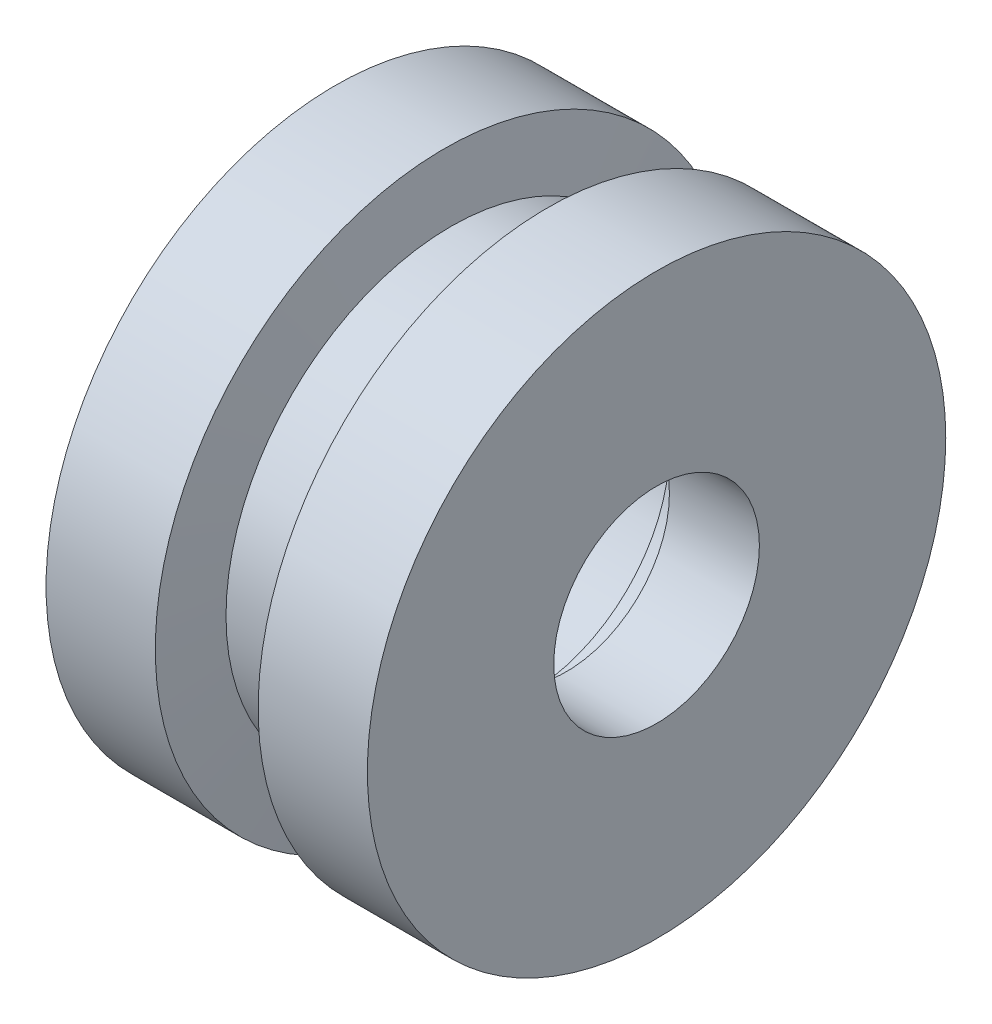
ISO-10303-21;
HEADER;
FILE_DESCRIPTION(('STEP AP214'),'2;1');
FILE_NAME('part.step','',(''),(''),'','','');
FILE_SCHEMA(('AUTOMOTIVE_DESIGN { 1 0 10303 214 1 1 1 1 }'));
ENDSEC;
DATA;
#1=APPLICATION_CONTEXT('core data for automotive mechanical design processes');
#2=APPLICATION_PROTOCOL_DEFINITION('international standard','automotive_design',2000,#1);
#3=PRODUCT_CONTEXT('',#1,'mechanical');
#4=PRODUCT('Part','Part','',(#3));
#5=PRODUCT_RELATED_PRODUCT_CATEGORY('part','',(#4));
#6=PRODUCT_DEFINITION_FORMATION('','',#4);
#7=PRODUCT_DEFINITION_CONTEXT('part definition',#1,'design');
#8=PRODUCT_DEFINITION('design','',#6,#7);
#9=PRODUCT_DEFINITION_SHAPE('','',#8);
#10=(LENGTH_UNIT() NAMED_UNIT(*) SI_UNIT(.MILLI.,.METRE.));
#11=(NAMED_UNIT(*) PLANE_ANGLE_UNIT() SI_UNIT($,.RADIAN.));
#12=(NAMED_UNIT(*) SI_UNIT($,.STERADIAN.) SOLID_ANGLE_UNIT());
#13=UNCERTAINTY_MEASURE_WITH_UNIT(LENGTH_MEASURE(1.E-05),#10,'distance_accuracy_value','');
#14=(GEOMETRIC_REPRESENTATION_CONTEXT(3) GLOBAL_UNCERTAINTY_ASSIGNED_CONTEXT((#13)) GLOBAL_UNIT_ASSIGNED_CONTEXT((#10,
#11,#12)) REPRESENTATION_CONTEXT('',''));
#15=CARTESIAN_POINT('',(0.,0.,0.));
#16=DIRECTION('',(0.,0.,1.));
#17=DIRECTION('',(1.,0.,0.));
#18=AXIS2_PLACEMENT_3D('',#15,#16,#17);
#19=CARTESIAN_POINT('',(0.,0.,0.));
#20=DIRECTION('',(-1.,0.,0.));
#21=DIRECTION('',(0.,0.,-1.));
#22=AXIS2_PLACEMENT_3D('',#19,#20,#21);
#23=CYLINDRICAL_SURFACE('',#22,22.5);
#24=CARTESIAN_POINT('',(0.,0.,0.));
#25=DIRECTION('',(1.,0.,0.));
#26=DIRECTION('',(0.,0.,-1.));
#27=AXIS2_PLACEMENT_3D('',#24,#25,#26);
#28=CIRCLE('',#27,22.5);
#29=CARTESIAN_POINT('',(0.,0.,-22.5));
#30=VERTEX_POINT('',#29);
#31=EDGE_CURVE('E62',#30,#30,#28,.T.);
#32=ORIENTED_EDGE('',*,*,#31,.T.);
#33=EDGE_LOOP('',(#32));
#34=FACE_BOUND('',#33,.T.);
#35=CARTESIAN_POINT('',(8.49999999999999,0.,0.));
#36=DIRECTION('',(1.,0.,0.));
#37=DIRECTION('',(0.,0.,-1.));
#38=AXIS2_PLACEMENT_3D('',#35,#36,#37);
#39=CIRCLE('',#38,22.5);
#40=CARTESIAN_POINT('',(8.49999999999998,0.,-22.5));
#41=VERTEX_POINT('',#40);
#42=EDGE_CURVE('E65',#41,#41,#39,.T.);
#43=ORIENTED_EDGE('',*,*,#42,.F.);
#44=EDGE_LOOP('',(#43));
#45=FACE_BOUND('',#44,.T.);
#46=ADVANCED_FACE('F33',(#34,#45),#23,.T.);
#47=CARTESIAN_POINT('',(25.,0.,0.));
#48=DIRECTION('',(1.,0.,0.));
#49=DIRECTION('',(0.,0.,-1.));
#50=AXIS2_PLACEMENT_3D('',#47,#48,#49);
#51=CIRCLE('',#50,22.5);
#52=CARTESIAN_POINT('',(25.,0.,-22.5));
#53=VERTEX_POINT('',#52);
#54=EDGE_CURVE('E59',#53,#53,#51,.T.);
#55=ORIENTED_EDGE('',*,*,#54,.F.);
#56=EDGE_LOOP('',(#55));
#57=FACE_BOUND('',#56,.T.);
#58=CARTESIAN_POINT('',(16.5,0.,0.));
#59=DIRECTION('',(1.,0.,0.));
#60=DIRECTION('',(0.,0.,-1.));
#61=AXIS2_PLACEMENT_3D('',#58,#59,#60);
#62=CIRCLE('',#61,22.5);
#63=CARTESIAN_POINT('',(16.5,0.,-22.5));
#64=VERTEX_POINT('',#63);
#65=EDGE_CURVE('E74',#64,#64,#62,.T.);
#66=ORIENTED_EDGE('',*,*,#65,.T.);
#67=EDGE_LOOP('',(#66));
#68=FACE_BOUND('',#67,.T.);
#69=ADVANCED_FACE('F78',(#57,#68),#23,.T.);
#70=CARTESIAN_POINT('',(0.,0.,22.5));
#71=DIRECTION('',(1.,0.,0.));
#72=DIRECTION('',(0.,0.,1.));
#73=AXIS2_PLACEMENT_3D('',#70,#71,#72);
#74=PLANE('',#73);
#75=CARTESIAN_POINT('',(0.,0.,0.));
#76=DIRECTION('',(1.,0.,0.));
#77=DIRECTION('',(0.,0.,-1.));
#78=AXIS2_PLACEMENT_3D('',#75,#76,#77);
#79=CIRCLE('',#78,12.);
#80=CARTESIAN_POINT('',(0.,0.,-12.));
#81=VERTEX_POINT('',#80);
#82=EDGE_CURVE('E10',#81,#81,#79,.T.);
#83=ORIENTED_EDGE('',*,*,#82,.T.);
#84=EDGE_LOOP('',(#83));
#85=FACE_BOUND('',#84,.T.);
#86=ORIENTED_EDGE('',*,*,#31,.F.);
#87=EDGE_LOOP('',(#86));
#88=FACE_BOUND('',#87,.T.);
#89=ADVANCED_FACE('F35',(#85,#88),#74,.F.);
#90=CARTESIAN_POINT('',(0.,0.,0.));
#91=DIRECTION('',(-1.,0.,0.));
#92=DIRECTION('',(0.,0.,-1.));
#93=AXIS2_PLACEMENT_3D('',#90,#91,#92);
#94=CYLINDRICAL_SURFACE('',#93,12.);
#95=CARTESIAN_POINT('',(15.,0.,0.));
#96=DIRECTION('',(1.,0.,0.));
#97=DIRECTION('',(0.,0.,-1.));
#98=AXIS2_PLACEMENT_3D('',#95,#96,#97);
#99=CIRCLE('',#98,12.);
#100=CARTESIAN_POINT('',(15.,0.,-12.));
#101=VERTEX_POINT('',#100);
#102=EDGE_CURVE('E40',#101,#101,#99,.T.);
#103=ORIENTED_EDGE('',*,*,#102,.T.);
#104=EDGE_LOOP('',(#103));
#105=FACE_BOUND('',#104,.T.);
#106=ORIENTED_EDGE('',*,*,#82,.F.);
#107=EDGE_LOOP('',(#106));
#108=FACE_BOUND('',#107,.T.);
#109=ADVANCED_FACE('F124',(#105,#108),#94,.F.);
#110=CARTESIAN_POINT('',(15.,0.,12.));
#111=DIRECTION('',(1.,0.,0.));
#112=DIRECTION('',(0.,0.,1.));
#113=AXIS2_PLACEMENT_3D('',#110,#111,#112);
#114=PLANE('',#113);
#115=CARTESIAN_POINT('',(15.,0.,0.));
#116=DIRECTION('',(1.,0.,0.));
#117=DIRECTION('',(0.,0.,-1.));
#118=AXIS2_PLACEMENT_3D('',#115,#116,#117);
#119=CIRCLE('',#118,11.);
#120=CARTESIAN_POINT('',(15.,0.,-11.));
#121=VERTEX_POINT('',#120);
#122=EDGE_CURVE('E44',#121,#121,#119,.T.);
#123=ORIENTED_EDGE('',*,*,#122,.T.);
#124=EDGE_LOOP('',(#123));
#125=FACE_BOUND('',#124,.T.);
#126=ORIENTED_EDGE('',*,*,#102,.F.);
#127=EDGE_LOOP('',(#126));
#128=FACE_BOUND('',#127,.T.);
#129=ADVANCED_FACE('F121',(#125,#128),#114,.F.);
#130=CARTESIAN_POINT('',(0.,0.,0.));
#131=DIRECTION('',(-1.,0.,0.));
#132=DIRECTION('',(0.,0.,-1.));
#133=AXIS2_PLACEMENT_3D('',#130,#131,#132);
#134=CYLINDRICAL_SURFACE('',#133,11.);
#135=CARTESIAN_POINT('',(18.,0.,0.));
#136=DIRECTION('',(1.,0.,0.));
#137=DIRECTION('',(0.,0.,-1.));
#138=AXIS2_PLACEMENT_3D('',#135,#136,#137);
#139=CIRCLE('',#138,11.);
#140=CARTESIAN_POINT('',(18.,0.,-11.));
#141=VERTEX_POINT('',#140);
#142=EDGE_CURVE('E48',#141,#141,#139,.T.);
#143=ORIENTED_EDGE('',*,*,#142,.T.);
#144=EDGE_LOOP('',(#143));
#145=FACE_BOUND('',#144,.T.);
#146=ORIENTED_EDGE('',*,*,#122,.F.);
#147=EDGE_LOOP('',(#146));
#148=FACE_BOUND('',#147,.T.);
#149=ADVANCED_FACE('F117',(#145,#148),#134,.F.);
#150=CARTESIAN_POINT('',(18.,0.,11.));
#151=DIRECTION('',(1.,0.,0.));
#152=DIRECTION('',(0.,0.,1.));
#153=AXIS2_PLACEMENT_3D('',#150,#151,#152);
#154=PLANE('',#153);
#155=CARTESIAN_POINT('',(18.,0.,0.));
#156=DIRECTION('',(1.,0.,0.));
#157=DIRECTION('',(0.,0.,-1.));
#158=AXIS2_PLACEMENT_3D('',#155,#156,#157);
#159=CIRCLE('',#158,8.);
#160=CARTESIAN_POINT('',(18.,0.,-8.));
#161=VERTEX_POINT('',#160);
#162=EDGE_CURVE('E53',#161,#161,#159,.T.);
#163=ORIENTED_EDGE('',*,*,#162,.T.);
#164=EDGE_LOOP('',(#163));
#165=FACE_BOUND('',#164,.T.);
#166=ORIENTED_EDGE('',*,*,#142,.F.);
#167=EDGE_LOOP('',(#166));
#168=FACE_BOUND('',#167,.T.);
#169=ADVANCED_FACE('F113',(#165,#168),#154,.F.);
#170=CARTESIAN_POINT('',(0.,0.,0.));
#171=DIRECTION('',(-1.,0.,0.));
#172=DIRECTION('',(0.,0.,-1.));
#173=AXIS2_PLACEMENT_3D('',#170,#171,#172);
#174=CYLINDRICAL_SURFACE('',#173,8.);
#175=CARTESIAN_POINT('',(25.,0.,0.));
#176=DIRECTION('',(1.,0.,0.));
#177=DIRECTION('',(0.,0.,-1.));
#178=AXIS2_PLACEMENT_3D('',#175,#176,#177);
#179=CIRCLE('',#178,8.);
#180=CARTESIAN_POINT('',(25.,0.,-8.));
#181=VERTEX_POINT('',#180);
#182=EDGE_CURVE('E56',#181,#181,#179,.T.);
#183=ORIENTED_EDGE('',*,*,#182,.T.);
#184=EDGE_LOOP('',(#183));
#185=FACE_BOUND('',#184,.T.);
#186=ORIENTED_EDGE('',*,*,#162,.F.);
#187=EDGE_LOOP('',(#186));
#188=FACE_BOUND('',#187,.T.);
#189=ADVANCED_FACE('F109',(#185,#188),#174,.F.);
#190=CARTESIAN_POINT('',(25.,0.,22.5));
#191=DIRECTION('',(-1.,0.,0.));
#192=DIRECTION('',(0.,0.,-1.));
#193=AXIS2_PLACEMENT_3D('',#190,#191,#192);
#194=PLANE('',#193);
#195=ORIENTED_EDGE('',*,*,#54,.T.);
#196=EDGE_LOOP('',(#195));
#197=FACE_BOUND('',#196,.T.);
#198=ORIENTED_EDGE('',*,*,#182,.F.);
#199=EDGE_LOOP('',(#198));
#200=FACE_BOUND('',#199,.T.);
#201=ADVANCED_FACE('F95',(#197,#200),#194,.F.);
#202=CARTESIAN_POINT('',(8.49999999999999,0.,0.));
#203=DIRECTION('',(-1.,0.,0.));
#204=DIRECTION('',(0.,0.,-1.));
#205=AXIS2_PLACEMENT_3D('',#202,#203,#204);
#206=CONICAL_SURFACE('',#205,22.5,1.47112767430373);
#207=CARTESIAN_POINT('',(8.99999999999999,0.,0.));
#208=DIRECTION('',(1.,0.,0.));
#209=DIRECTION('',(0.,0.,-1.));
#210=AXIS2_PLACEMENT_3D('',#207,#208,#209);
#211=CIRCLE('',#210,17.5);
#212=CARTESIAN_POINT('',(8.99999999999998,0.,-17.5));
#213=VERTEX_POINT('',#212);
#214=EDGE_CURVE('E68',#213,#213,#211,.T.);
#215=ORIENTED_EDGE('',*,*,#214,.F.);
#216=EDGE_LOOP('',(#215));
#217=FACE_BOUND('',#216,.T.);
#218=ORIENTED_EDGE('',*,*,#42,.T.);
#219=EDGE_LOOP('',(#218));
#220=FACE_BOUND('',#219,.T.);
#221=ADVANCED_FACE('F89',(#217,#220),#206,.T.);
#222=CARTESIAN_POINT('',(0.,0.,0.));
#223=DIRECTION('',(-1.,0.,0.));
#224=DIRECTION('',(0.,0.,-1.));
#225=AXIS2_PLACEMENT_3D('',#222,#223,#224);
#226=CYLINDRICAL_SURFACE('',#225,17.5);
#227=CARTESIAN_POINT('',(16.,0.,0.));
#228=DIRECTION('',(1.,0.,0.));
#229=DIRECTION('',(0.,0.,-1.));
#230=AXIS2_PLACEMENT_3D('',#227,#228,#229);
#231=CIRCLE('',#230,17.5);
#232=CARTESIAN_POINT('',(16.,0.,-17.5));
#233=VERTEX_POINT('',#232);
#234=EDGE_CURVE('E71',#233,#233,#231,.T.);
#235=ORIENTED_EDGE('',*,*,#234,.F.);
#236=EDGE_LOOP('',(#235));
#237=FACE_BOUND('',#236,.T.);
#238=ORIENTED_EDGE('',*,*,#214,.T.);
#239=EDGE_LOOP('',(#238));
#240=FACE_BOUND('',#239,.T.);
#241=ADVANCED_FACE('F83',(#237,#240),#226,.T.);
#242=CARTESIAN_POINT('',(16.,0.,0.));
#243=DIRECTION('',(1.,0.,0.));
#244=DIRECTION('',(0.,0.,1.));
#245=AXIS2_PLACEMENT_3D('',#242,#243,#244);
#246=CONICAL_SURFACE('',#245,17.5,1.47112767430374);
#247=ORIENTED_EDGE('',*,*,#65,.F.);
#248=EDGE_LOOP('',(#247));
#249=FACE_BOUND('',#248,.T.);
#250=ORIENTED_EDGE('',*,*,#234,.T.);
#251=EDGE_LOOP('',(#250));
#252=FACE_BOUND('',#251,.T.);
#253=ADVANCED_FACE('F80',(#249,#252),#246,.T.);
#254=CLOSED_SHELL('',(#46,#69,#89,#109,#129,#149,#169,#189,#201,#221,#241,#253));
#255=MANIFOLD_SOLID_BREP('B2',#254);
#256=ADVANCED_BREP_SHAPE_REPRESENTATION('',(#18,#255),#14);
#257=SHAPE_DEFINITION_REPRESENTATION(#9,#256);
ENDSEC;
END-ISO-10303-21;
